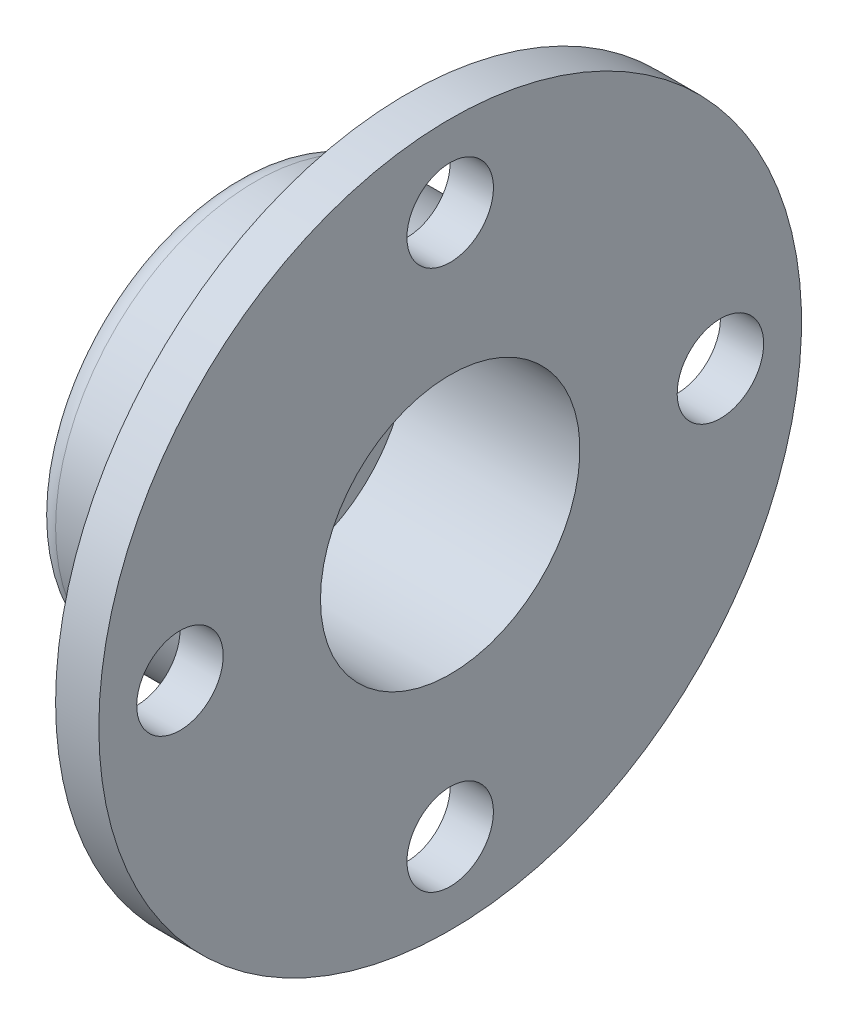
ISO-10303-21;
HEADER;
FILE_DESCRIPTION(('STEP AP214'),'2;1');
FILE_NAME('part.step','',(''),(''),'','','');
FILE_SCHEMA(('AUTOMOTIVE_DESIGN { 1 0 10303 214 1 1 1 1 }'));
ENDSEC;
DATA;
#1=APPLICATION_CONTEXT('core data for automotive mechanical design processes');
#2=APPLICATION_PROTOCOL_DEFINITION('international standard','automotive_design',2000,#1);
#3=PRODUCT_CONTEXT('',#1,'mechanical');
#4=PRODUCT('Part','Part','',(#3));
#5=PRODUCT_RELATED_PRODUCT_CATEGORY('part','',(#4));
#6=PRODUCT_DEFINITION_FORMATION('','',#4);
#7=PRODUCT_DEFINITION_CONTEXT('part definition',#1,'design');
#8=PRODUCT_DEFINITION('design','',#6,#7);
#9=PRODUCT_DEFINITION_SHAPE('','',#8);
#10=(LENGTH_UNIT() NAMED_UNIT(*) SI_UNIT(.MILLI.,.METRE.));
#11=(NAMED_UNIT(*) PLANE_ANGLE_UNIT() SI_UNIT($,.RADIAN.));
#12=(NAMED_UNIT(*) SI_UNIT($,.STERADIAN.) SOLID_ANGLE_UNIT());
#13=UNCERTAINTY_MEASURE_WITH_UNIT(LENGTH_MEASURE(1.E-05),#10,'distance_accuracy_value','');
#14=(GEOMETRIC_REPRESENTATION_CONTEXT(3) GLOBAL_UNCERTAINTY_ASSIGNED_CONTEXT((#13)) GLOBAL_UNIT_ASSIGNED_CONTEXT((#10,
#11,#12)) REPRESENTATION_CONTEXT('',''));
#15=CARTESIAN_POINT('',(0.,0.,0.));
#16=DIRECTION('',(0.,0.,1.));
#17=DIRECTION('',(1.,0.,0.));
#18=AXIS2_PLACEMENT_3D('',#15,#16,#17);
#19=CARTESIAN_POINT('',(-155.979583506536,0.,0.));
#20=DIRECTION('',(-1.,0.,0.));
#21=DIRECTION('',(0.,0.,1.));
#22=AXIS2_PLACEMENT_3D('',#19,#20,#21);
#23=CYLINDRICAL_SURFACE('',#22,50.8);
#24=CARTESIAN_POINT('',(25.4,0.,0.));
#25=DIRECTION('',(-1.,0.,0.));
#26=DIRECTION('',(0.,0.,1.));
#27=AXIS2_PLACEMENT_3D('',#24,#25,#26);
#28=CIRCLE('',#27,50.8);
#29=CARTESIAN_POINT('',(25.4,0.,50.8));
#30=VERTEX_POINT('',#29);
#31=EDGE_CURVE('E85',#30,#30,#28,.T.);
#32=ORIENTED_EDGE('',*,*,#31,.F.);
#33=EDGE_LOOP('',(#32));
#34=FACE_BOUND('',#33,.T.);
#35=CARTESIAN_POINT('',(0.,0.,0.));
#36=DIRECTION('',(-1.,0.,0.));
#37=DIRECTION('',(0.,0.,1.));
#38=AXIS2_PLACEMENT_3D('',#35,#36,#37);
#39=CIRCLE('',#38,50.8);
#40=CARTESIAN_POINT('',(0.,0.,50.8));
#41=VERTEX_POINT('',#40);
#42=EDGE_CURVE('E105',#41,#41,#39,.T.);
#43=ORIENTED_EDGE('',*,*,#42,.T.);
#44=EDGE_LOOP('',(#43));
#45=FACE_BOUND('',#44,.T.);
#46=ADVANCED_FACE('F57',(#34,#45),#23,.F.);
#47=CARTESIAN_POINT('',(25.4,0.,-50.8));
#48=DIRECTION('',(-1.,0.,0.));
#49=DIRECTION('',(0.,0.,1.));
#50=AXIS2_PLACEMENT_3D('',#47,#48,#49);
#51=PLANE('',#50);
#52=CARTESIAN_POINT('',(25.4,0.,0.));
#53=DIRECTION('',(-1.,0.,0.));
#54=DIRECTION('',(0.,0.,1.));
#55=AXIS2_PLACEMENT_3D('',#52,#53,#54);
#56=CIRCLE('',#55,76.2);
#57=CARTESIAN_POINT('',(25.4,0.,76.2));
#58=VERTEX_POINT('',#57);
#59=EDGE_CURVE('E89',#58,#58,#56,.T.);
#60=ORIENTED_EDGE('',*,*,#59,.F.);
#61=EDGE_LOOP('',(#60));
#62=FACE_BOUND('',#61,.T.);
#63=ORIENTED_EDGE('',*,*,#31,.T.);
#64=EDGE_LOOP('',(#63));
#65=FACE_BOUND('',#64,.T.);
#66=ADVANCED_FACE('F182',(#62,#65),#51,.F.);
#67=CARTESIAN_POINT('',(-155.979583506536,0.,0.));
#68=DIRECTION('',(-1.,0.,0.));
#69=DIRECTION('',(0.,0.,1.));
#70=AXIS2_PLACEMENT_3D('',#67,#68,#69);
#71=CYLINDRICAL_SURFACE('',#70,76.2);
#72=CARTESIAN_POINT('',(127.,0.,0.));
#73=DIRECTION('',(-1.,0.,0.));
#74=DIRECTION('',(0.,0.,1.));
#75=AXIS2_PLACEMENT_3D('',#72,#73,#74);
#76=CIRCLE('',#75,76.2);
#77=CARTESIAN_POINT('',(127.,0.,76.2));
#78=VERTEX_POINT('',#77);
#79=EDGE_CURVE('E93',#78,#78,#76,.T.);
#80=ORIENTED_EDGE('',*,*,#79,.F.);
#81=EDGE_LOOP('',(#80));
#82=FACE_BOUND('',#81,.T.);
#83=ORIENTED_EDGE('',*,*,#59,.T.);
#84=EDGE_LOOP('',(#83));
#85=FACE_BOUND('',#84,.T.);
#86=ADVANCED_FACE('F176',(#82,#85),#71,.F.);
#87=CARTESIAN_POINT('',(127.,0.,-76.2));
#88=DIRECTION('',(-1.,0.,0.));
#89=DIRECTION('',(0.,0.,1.));
#90=AXIS2_PLACEMENT_3D('',#87,#88,#89);
#91=PLANE('',#90);
#92=CARTESIAN_POINT('',(127.,-5.54272662541347E-13,-158.75));
#93=DIRECTION('',(-1.,0.,0.));
#94=DIRECTION('',(0.,1.,0.));
#95=AXIS2_PLACEMENT_3D('',#92,#93,#94);
#96=CIRCLE('',#95,25.4);
#97=CARTESIAN_POINT('',(127.,25.3999999999994,-158.75));
#98=VERTEX_POINT('',#97);
#99=EDGE_CURVE('E114',#98,#98,#96,.T.);
#100=ORIENTED_EDGE('',*,*,#99,.T.);
#101=EDGE_LOOP('',(#100));
#102=FACE_BOUND('',#101,.T.);
#103=CARTESIAN_POINT('',(127.,-158.75,0.));
#104=DIRECTION('',(-1.,0.,0.));
#105=DIRECTION('',(0.,0.,-1.));
#106=AXIS2_PLACEMENT_3D('',#103,#104,#105);
#107=CIRCLE('',#106,25.4);
#108=CARTESIAN_POINT('',(127.,-158.75,-25.4));
#109=VERTEX_POINT('',#108);
#110=EDGE_CURVE('E130',#109,#109,#107,.T.);
#111=ORIENTED_EDGE('',*,*,#110,.T.);
#112=EDGE_LOOP('',(#111));
#113=FACE_BOUND('',#112,.T.);
#114=CARTESIAN_POINT('',(127.,1.66281798762404E-12,158.75));
#115=DIRECTION('',(-1.,0.,0.));
#116=DIRECTION('',(0.,-1.,0.));
#117=AXIS2_PLACEMENT_3D('',#114,#115,#116);
#118=CIRCLE('',#117,25.4);
#119=CARTESIAN_POINT('',(127.,-25.3999999999983,158.75));
#120=VERTEX_POINT('',#119);
#121=EDGE_CURVE('E122',#120,#120,#118,.T.);
#122=ORIENTED_EDGE('',*,*,#121,.T.);
#123=EDGE_LOOP('',(#122));
#124=FACE_BOUND('',#123,.T.);
#125=CARTESIAN_POINT('',(127.,158.75,0.));
#126=DIRECTION('',(-1.,0.,0.));
#127=DIRECTION('',(0.,0.,1.));
#128=AXIS2_PLACEMENT_3D('',#125,#126,#127);
#129=CIRCLE('',#128,25.4);
#130=CARTESIAN_POINT('',(127.,158.75,25.4));
#131=VERTEX_POINT('',#130);
#132=EDGE_CURVE('E109',#131,#131,#129,.T.);
#133=ORIENTED_EDGE('',*,*,#132,.T.);
#134=EDGE_LOOP('',(#133));
#135=FACE_BOUND('',#134,.T.);
#136=CARTESIAN_POINT('',(127.,0.,0.));
#137=DIRECTION('',(-1.,0.,0.));
#138=DIRECTION('',(0.,0.,1.));
#139=AXIS2_PLACEMENT_3D('',#136,#137,#138);
#140=CIRCLE('',#139,206.402925504952);
#141=CARTESIAN_POINT('',(127.,0.,206.402925504952));
#142=VERTEX_POINT('',#141);
#143=EDGE_CURVE('E97',#142,#142,#140,.T.);
#144=ORIENTED_EDGE('',*,*,#143,.F.);
#145=EDGE_LOOP('',(#144));
#146=FACE_BOUND('',#145,.T.);
#147=ORIENTED_EDGE('',*,*,#79,.T.);
#148=EDGE_LOOP('',(#147));
#149=FACE_BOUND('',#148,.T.);
#150=ADVANCED_FACE('F144',(#102,#113,#124,#135,#146,#149),#91,.F.);
#151=CARTESIAN_POINT('',(-155.979583506536,0.,0.));
#152=DIRECTION('',(-1.,0.,0.));
#153=DIRECTION('',(0.,0.,1.));
#154=AXIS2_PLACEMENT_3D('',#151,#152,#153);
#155=CYLINDRICAL_SURFACE('',#154,206.402925504952);
#156=CARTESIAN_POINT('',(101.6,0.,0.));
#157=DIRECTION('',(-1.,0.,0.));
#158=DIRECTION('',(0.,0.,1.));
#159=AXIS2_PLACEMENT_3D('',#156,#157,#158);
#160=CIRCLE('',#159,206.402925504952);
#161=CARTESIAN_POINT('',(101.6,0.,206.402925504952));
#162=VERTEX_POINT('',#161);
#163=EDGE_CURVE('E101',#162,#162,#160,.T.);
#164=ORIENTED_EDGE('',*,*,#163,.F.);
#165=EDGE_LOOP('',(#164));
#166=FACE_BOUND('',#165,.T.);
#167=ORIENTED_EDGE('',*,*,#143,.T.);
#168=EDGE_LOOP('',(#167));
#169=FACE_BOUND('',#168,.T.);
#170=ADVANCED_FACE('F159',(#166,#169),#155,.T.);
#171=CARTESIAN_POINT('',(101.6,0.,-117.502925504952));
#172=DIRECTION('',(1.,0.,0.));
#173=DIRECTION('',(0.,0.,-1.));
#174=AXIS2_PLACEMENT_3D('',#171,#172,#173);
#175=PLANE('',#174);
#176=CARTESIAN_POINT('',(101.6,0.,0.));
#177=DIRECTION('',(1.,0.,0.));
#178=DIRECTION('',(0.,0.,-1.));
#179=AXIS2_PLACEMENT_3D('',#176,#177,#178);
#180=CIRCLE('',#179,130.202925504952);
#181=CARTESIAN_POINT('',(101.6,0.,-130.202925504952));
#182=VERTEX_POINT('',#181);
#183=EDGE_CURVE('E12',#182,#182,#180,.T.);
#184=ORIENTED_EDGE('',*,*,#183,.T.);
#185=EDGE_LOOP('',(#184));
#186=FACE_BOUND('',#185,.T.);
#187=CARTESIAN_POINT('',(101.6,-5.54272662541347E-13,-158.75));
#188=DIRECTION('',(-1.,0.,0.));
#189=DIRECTION('',(0.,1.,0.));
#190=AXIS2_PLACEMENT_3D('',#187,#188,#189);
#191=CIRCLE('',#190,25.4);
#192=CARTESIAN_POINT('',(101.6,25.3999999999994,-158.75));
#193=VERTEX_POINT('',#192);
#194=EDGE_CURVE('E134',#193,#193,#191,.T.);
#195=ORIENTED_EDGE('',*,*,#194,.F.);
#196=EDGE_LOOP('',(#195));
#197=FACE_BOUND('',#196,.T.);
#198=CARTESIAN_POINT('',(101.6,-158.75,0.));
#199=DIRECTION('',(-1.,0.,0.));
#200=DIRECTION('',(0.,0.,-1.));
#201=AXIS2_PLACEMENT_3D('',#198,#199,#200);
#202=CIRCLE('',#201,25.4);
#203=CARTESIAN_POINT('',(101.6,-158.75,-25.4));
#204=VERTEX_POINT('',#203);
#205=EDGE_CURVE('E126',#204,#204,#202,.T.);
#206=ORIENTED_EDGE('',*,*,#205,.F.);
#207=EDGE_LOOP('',(#206));
#208=FACE_BOUND('',#207,.T.);
#209=CARTESIAN_POINT('',(101.6,1.66281798762404E-12,158.75));
#210=DIRECTION('',(-1.,0.,0.));
#211=DIRECTION('',(0.,-1.,0.));
#212=AXIS2_PLACEMENT_3D('',#209,#210,#211);
#213=CIRCLE('',#212,25.4);
#214=CARTESIAN_POINT('',(101.6,-25.3999999999983,158.75));
#215=VERTEX_POINT('',#214);
#216=EDGE_CURVE('E118',#215,#215,#213,.T.);
#217=ORIENTED_EDGE('',*,*,#216,.F.);
#218=EDGE_LOOP('',(#217));
#219=FACE_BOUND('',#218,.T.);
#220=CARTESIAN_POINT('',(101.6,158.75,0.));
#221=DIRECTION('',(-1.,0.,0.));
#222=DIRECTION('',(0.,0.,1.));
#223=AXIS2_PLACEMENT_3D('',#220,#221,#222);
#224=CIRCLE('',#223,25.4);
#225=CARTESIAN_POINT('',(101.6,158.75,25.4));
#226=VERTEX_POINT('',#225);
#227=EDGE_CURVE('E110',#226,#226,#224,.T.);
#228=ORIENTED_EDGE('',*,*,#227,.F.);
#229=EDGE_LOOP('',(#228));
#230=FACE_BOUND('',#229,.T.);
#231=ORIENTED_EDGE('',*,*,#163,.T.);
#232=EDGE_LOOP('',(#231));
#233=FACE_BOUND('',#232,.T.);
#234=ADVANCED_FACE('F155',(#186,#197,#208,#219,#230,#233),#175,.F.);
#235=CARTESIAN_POINT('',(-155.979583506536,0.,0.));
#236=DIRECTION('',(-1.,0.,0.));
#237=DIRECTION('',(0.,0.,1.));
#238=AXIS2_PLACEMENT_3D('',#235,#236,#237);
#239=CYLINDRICAL_SURFACE('',#238,117.502925504952);
#240=CARTESIAN_POINT('',(12.7,0.,0.));
#241=DIRECTION('',(1.,0.,0.));
#242=DIRECTION('',(0.,0.,-1.));
#243=AXIS2_PLACEMENT_3D('',#240,#241,#242);
#244=CIRCLE('',#243,117.502925504952);
#245=CARTESIAN_POINT('',(12.7,0.,-117.502925504952));
#246=VERTEX_POINT('',#245);
#247=EDGE_CURVE('E65',#246,#246,#244,.T.);
#248=ORIENTED_EDGE('',*,*,#247,.T.);
#249=EDGE_LOOP('',(#248));
#250=FACE_BOUND('',#249,.T.);
#251=CARTESIAN_POINT('',(88.9,0.,0.));
#252=DIRECTION('',(1.,0.,0.));
#253=DIRECTION('',(0.,0.,-1.));
#254=AXIS2_PLACEMENT_3D('',#251,#252,#253);
#255=CIRCLE('',#254,117.502925504952);
#256=CARTESIAN_POINT('',(88.9,0.,-117.502925504952));
#257=VERTEX_POINT('',#256);
#258=EDGE_CURVE('E72',#257,#257,#255,.F.);
#259=ORIENTED_EDGE('',*,*,#258,.T.);
#260=EDGE_LOOP('',(#259));
#261=FACE_BOUND('',#260,.T.);
#262=ADVANCED_FACE('F158',(#250,#261),#239,.T.);
#263=CARTESIAN_POINT('',(0.,0.,-50.8));
#264=DIRECTION('',(1.,0.,0.));
#265=DIRECTION('',(0.,0.,-1.));
#266=AXIS2_PLACEMENT_3D('',#263,#264,#265);
#267=PLANE('',#266);
#268=CARTESIAN_POINT('',(0.,0.,0.));
#269=DIRECTION('',(1.,0.,0.));
#270=DIRECTION('',(0.,0.,-1.));
#271=AXIS2_PLACEMENT_3D('',#268,#269,#270);
#272=CIRCLE('',#271,104.802925504952);
#273=CARTESIAN_POINT('',(0.,0.,-104.802925504952));
#274=VERTEX_POINT('',#273);
#275=EDGE_CURVE('E79',#274,#274,#272,.F.);
#276=ORIENTED_EDGE('',*,*,#275,.T.);
#277=EDGE_LOOP('',(#276));
#278=FACE_BOUND('',#277,.T.);
#279=ORIENTED_EDGE('',*,*,#42,.F.);
#280=EDGE_LOOP('',(#279));
#281=FACE_BOUND('',#280,.T.);
#282=ADVANCED_FACE('F196',(#278,#281),#267,.F.);
#283=CARTESIAN_POINT('',(127.,158.75,0.));
#284=DIRECTION('',(-1.,0.,0.));
#285=DIRECTION('',(0.,0.,1.));
#286=AXIS2_PLACEMENT_3D('',#283,#284,#285);
#287=CYLINDRICAL_SURFACE('',#286,25.4);
#288=ORIENTED_EDGE('',*,*,#132,.F.);
#289=EDGE_LOOP('',(#288));
#290=FACE_BOUND('',#289,.T.);
#291=ORIENTED_EDGE('',*,*,#227,.T.);
#292=EDGE_LOOP('',(#291));
#293=FACE_BOUND('',#292,.T.);
#294=ADVANCED_FACE('F198',(#290,#293),#287,.F.);
#295=CARTESIAN_POINT('',(127.,1.66281798762404E-12,158.75));
#296=DIRECTION('',(-1.,0.,0.));
#297=DIRECTION('',(0.,0.,1.));
#298=AXIS2_PLACEMENT_3D('',#295,#296,#297);
#299=CYLINDRICAL_SURFACE('',#298,25.4);
#300=ORIENTED_EDGE('',*,*,#121,.F.);
#301=EDGE_LOOP('',(#300));
#302=FACE_BOUND('',#301,.T.);
#303=ORIENTED_EDGE('',*,*,#216,.T.);
#304=EDGE_LOOP('',(#303));
#305=FACE_BOUND('',#304,.T.);
#306=ADVANCED_FACE('F206',(#302,#305),#299,.F.);
#307=CARTESIAN_POINT('',(127.,-158.75,0.));
#308=DIRECTION('',(-1.,0.,0.));
#309=DIRECTION('',(0.,0.,1.));
#310=AXIS2_PLACEMENT_3D('',#307,#308,#309);
#311=CYLINDRICAL_SURFACE('',#310,25.4);
#312=ORIENTED_EDGE('',*,*,#110,.F.);
#313=EDGE_LOOP('',(#312));
#314=FACE_BOUND('',#313,.T.);
#315=ORIENTED_EDGE('',*,*,#205,.T.);
#316=EDGE_LOOP('',(#315));
#317=FACE_BOUND('',#316,.T.);
#318=ADVANCED_FACE('F151',(#314,#317),#311,.F.);
#319=CARTESIAN_POINT('',(127.,-5.54272662541347E-13,-158.75));
#320=DIRECTION('',(-1.,0.,0.));
#321=DIRECTION('',(0.,0.,1.));
#322=AXIS2_PLACEMENT_3D('',#319,#320,#321);
#323=CYLINDRICAL_SURFACE('',#322,25.4);
#324=ORIENTED_EDGE('',*,*,#99,.F.);
#325=EDGE_LOOP('',(#324));
#326=FACE_BOUND('',#325,.T.);
#327=ORIENTED_EDGE('',*,*,#194,.T.);
#328=EDGE_LOOP('',(#327));
#329=FACE_BOUND('',#328,.T.);
#330=ADVANCED_FACE('F147',(#326,#329),#323,.F.);
#331=CARTESIAN_POINT('',(12.7,0.,0.));
#332=DIRECTION('',(1.,0.,0.));
#333=DIRECTION('',(0.,0.,-1.));
#334=AXIS2_PLACEMENT_3D('',#331,#332,#333);
#335=TOROIDAL_SURFACE('',#334,104.802925504952,12.7);
#336=ORIENTED_EDGE('',*,*,#247,.F.);
#337=EDGE_LOOP('',(#336));
#338=FACE_BOUND('',#337,.T.);
#339=ORIENTED_EDGE('',*,*,#275,.F.);
#340=EDGE_LOOP('',(#339));
#341=FACE_BOUND('',#340,.T.);
#342=ADVANCED_FACE('F150',(#338,#341),#335,.T.);
#343=CARTESIAN_POINT('',(88.9,0.,0.));
#344=DIRECTION('',(1.,0.,0.));
#345=DIRECTION('',(0.,0.,-1.));
#346=AXIS2_PLACEMENT_3D('',#343,#344,#345);
#347=TOROIDAL_SURFACE('',#346,130.202925504952,12.7);
#348=ORIENTED_EDGE('',*,*,#183,.F.);
#349=EDGE_LOOP('',(#348));
#350=FACE_BOUND('',#349,.T.);
#351=ORIENTED_EDGE('',*,*,#258,.F.);
#352=EDGE_LOOP('',(#351));
#353=FACE_BOUND('',#352,.T.);
#354=ADVANCED_FACE('F59',(#350,#353),#347,.F.);
#355=CLOSED_SHELL('',(#46,#66,#86,#150,#170,#234,#262,#282,#294,#306,#318,#330,#342,#354));
#356=MANIFOLD_SOLID_BREP('B2',#355);
#357=ADVANCED_BREP_SHAPE_REPRESENTATION('',(#18,#356),#14);
#358=SHAPE_DEFINITION_REPRESENTATION(#9,#357);
ENDSEC;
END-ISO-10303-21;
